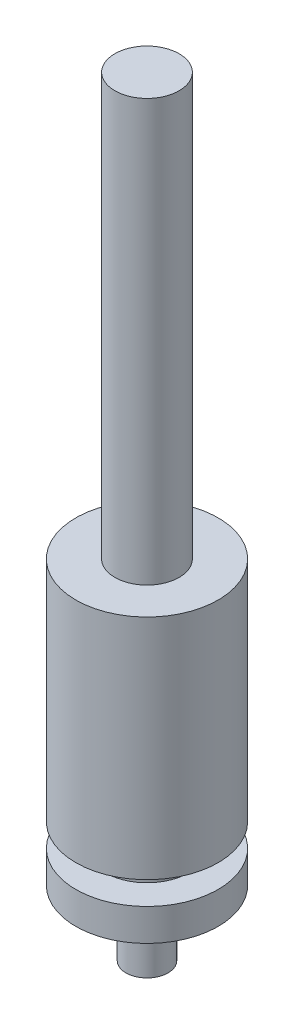
ISO-10303-21;
HEADER;
FILE_DESCRIPTION(('STEP AP214'),'2;1');
FILE_NAME('part.step','',(''),(''),'','','');
FILE_SCHEMA(('AUTOMOTIVE_DESIGN { 1 0 10303 214 1 1 1 1 }'));
ENDSEC;
DATA;
#1=APPLICATION_CONTEXT('core data for automotive mechanical design processes');
#2=APPLICATION_PROTOCOL_DEFINITION('international standard','automotive_design',2000,#1);
#3=PRODUCT_CONTEXT('',#1,'mechanical');
#4=PRODUCT('Part','Part','',(#3));
#5=PRODUCT_RELATED_PRODUCT_CATEGORY('part','',(#4));
#6=PRODUCT_DEFINITION_FORMATION('','',#4);
#7=PRODUCT_DEFINITION_CONTEXT('part definition',#1,'design');
#8=PRODUCT_DEFINITION('design','',#6,#7);
#9=PRODUCT_DEFINITION_SHAPE('','',#8);
#10=(LENGTH_UNIT() NAMED_UNIT(*) SI_UNIT(.MILLI.,.METRE.));
#11=(NAMED_UNIT(*) PLANE_ANGLE_UNIT() SI_UNIT($,.RADIAN.));
#12=(NAMED_UNIT(*) SI_UNIT($,.STERADIAN.) SOLID_ANGLE_UNIT());
#13=UNCERTAINTY_MEASURE_WITH_UNIT(LENGTH_MEASURE(1.E-05),#10,'distance_accuracy_value','');
#14=(GEOMETRIC_REPRESENTATION_CONTEXT(3) GLOBAL_UNCERTAINTY_ASSIGNED_CONTEXT((#13)) GLOBAL_UNIT_ASSIGNED_CONTEXT((#10,
#11,#12)) REPRESENTATION_CONTEXT('',''));
#15=CARTESIAN_POINT('',(0.,0.,0.));
#16=DIRECTION('',(0.,0.,1.));
#17=DIRECTION('',(1.,0.,0.));
#18=AXIS2_PLACEMENT_3D('',#15,#16,#17);
#19=CARTESIAN_POINT('',(0.,67.075,0.));
#20=DIRECTION('',(0.,1.,0.));
#21=DIRECTION('',(0.,0.,1.));
#22=AXIS2_PLACEMENT_3D('',#19,#20,#21);
#23=PLANE('',#22);
#24=CARTESIAN_POINT('',(0.,67.075,0.));
#25=DIRECTION('',(0.,1.,0.));
#26=DIRECTION('',(0.,0.,1.));
#27=AXIS2_PLACEMENT_3D('',#24,#25,#26);
#28=CIRCLE('',#27,16.891);
#29=CARTESIAN_POINT('',(0.,67.075,16.891));
#30=VERTEX_POINT('',#29);
#31=EDGE_CURVE('E54',#30,#30,#28,.T.);
#32=ORIENTED_EDGE('',*,*,#31,.T.);
#33=EDGE_LOOP('',(#32));
#34=FACE_BOUND('',#33,.T.);
#35=CARTESIAN_POINT('',(0.,67.075,0.));
#36=DIRECTION('',(0.,1.,0.));
#37=DIRECTION('',(0.,0.,1.));
#38=AXIS2_PLACEMENT_3D('',#35,#36,#37);
#39=CIRCLE('',#38,7.62);
#40=CARTESIAN_POINT('',(0.,67.075,7.62));
#41=VERTEX_POINT('',#40);
#42=EDGE_CURVE('E72',#41,#41,#39,.T.);
#43=ORIENTED_EDGE('',*,*,#42,.F.);
#44=EDGE_LOOP('',(#43));
#45=FACE_BOUND('',#44,.T.);
#46=ADVANCED_FACE('F33',(#34,#45),#23,.T.);
#47=CARTESIAN_POINT('',(0.,-15.5,0.));
#48=DIRECTION('',(0.,1.,0.));
#49=DIRECTION('',(0.,0.,1.));
#50=AXIS2_PLACEMENT_3D('',#47,#48,#49);
#51=CYLINDRICAL_SURFACE('',#50,5.5);
#52=CARTESIAN_POINT('',(0.,0.,0.));
#53=DIRECTION('',(0.,1.,0.));
#54=DIRECTION('',(0.,0.,1.));
#55=AXIS2_PLACEMENT_3D('',#52,#53,#54);
#56=CIRCLE('',#55,5.5);
#57=CARTESIAN_POINT('',(0.,0.,5.5));
#58=VERTEX_POINT('',#57);
#59=EDGE_CURVE('E10',#58,#58,#56,.F.);
#60=ORIENTED_EDGE('',*,*,#59,.T.);
#61=EDGE_LOOP('',(#60));
#62=FACE_BOUND('',#61,.T.);
#63=CARTESIAN_POINT('',(0.,-6.5,0.));
#64=DIRECTION('',(0.,-1.,0.));
#65=DIRECTION('',(0.,0.,-1.));
#66=AXIS2_PLACEMENT_3D('',#63,#64,#65);
#67=CIRCLE('',#66,5.5);
#68=CARTESIAN_POINT('',(0.,-6.5,-5.5));
#69=VERTEX_POINT('',#68);
#70=EDGE_CURVE('E60',#69,#69,#67,.T.);
#71=ORIENTED_EDGE('',*,*,#70,.F.);
#72=EDGE_LOOP('',(#71));
#73=FACE_BOUND('',#72,.T.);
#74=ADVANCED_FACE('F88',(#62,#73),#51,.T.);
#75=CARTESIAN_POINT('',(0.,0.,0.));
#76=DIRECTION('',(0.,1.,0.));
#77=DIRECTION('',(0.,0.,1.));
#78=AXIS2_PLACEMENT_3D('',#75,#76,#77);
#79=PLANE('',#78);
#80=CARTESIAN_POINT('',(0.,0.,0.));
#81=DIRECTION('',(0.,1.,0.));
#82=DIRECTION('',(0.,0.,1.));
#83=AXIS2_PLACEMENT_3D('',#80,#81,#82);
#84=CIRCLE('',#83,16.891);
#85=CARTESIAN_POINT('',(0.,0.,-16.891));
#86=VERTEX_POINT('',#85);
#87=EDGE_CURVE('E44',#86,#86,#84,.T.);
#88=ORIENTED_EDGE('',*,*,#87,.F.);
#89=EDGE_LOOP('',(#88));
#90=FACE_BOUND('',#89,.T.);
#91=ORIENTED_EDGE('',*,*,#59,.F.);
#92=EDGE_LOOP('',(#91));
#93=FACE_BOUND('',#92,.T.);
#94=ADVANCED_FACE('F96',(#90,#93),#79,.F.);
#95=CARTESIAN_POINT('',(0.,7.6,0.));
#96=DIRECTION('',(0.,1.,0.));
#97=DIRECTION('',(0.,0.,1.));
#98=AXIS2_PLACEMENT_3D('',#95,#96,#97);
#99=PLANE('',#98);
#100=CARTESIAN_POINT('',(0.,7.6,0.));
#101=DIRECTION('',(0.,1.,0.));
#102=DIRECTION('',(0.,0.,1.));
#103=AXIS2_PLACEMENT_3D('',#100,#101,#102);
#104=CIRCLE('',#103,16.891);
#105=CARTESIAN_POINT('',(0.,7.6,-16.891));
#106=VERTEX_POINT('',#105);
#107=EDGE_CURVE('E40',#106,#106,#104,.T.);
#108=ORIENTED_EDGE('',*,*,#107,.T.);
#109=EDGE_LOOP('',(#108));
#110=FACE_BOUND('',#109,.T.);
#111=CARTESIAN_POINT('',(0.,7.6,0.));
#112=DIRECTION('',(0.,1.,0.));
#113=DIRECTION('',(0.,0.,1.));
#114=AXIS2_PLACEMENT_3D('',#111,#112,#113);
#115=CIRCLE('',#114,9.99827606072005);
#116=CARTESIAN_POINT('',(0.,7.6,9.99827606072005));
#117=VERTEX_POINT('',#116);
#118=EDGE_CURVE('E51',#117,#117,#115,.T.);
#119=ORIENTED_EDGE('',*,*,#118,.F.);
#120=EDGE_LOOP('',(#119));
#121=FACE_BOUND('',#120,.T.);
#122=ADVANCED_FACE('F113',(#110,#121),#99,.T.);
#123=CARTESIAN_POINT('',(0.,7.6,0.));
#124=DIRECTION('',(0.,-1.,0.));
#125=DIRECTION('',(0.,0.,-1.));
#126=AXIS2_PLACEMENT_3D('',#123,#124,#125);
#127=CYLINDRICAL_SURFACE('',#126,16.891);
#128=CARTESIAN_POINT('',(0.,7.6,-16.891));
#129=CARTESIAN_POINT('',(0.,7.52083333333333,-16.891));
#130=CARTESIAN_POINT('',(0.,7.44166666666667,-16.891));
#131=CARTESIAN_POINT('',(0.,7.28333333333333,-16.891));
#132=CARTESIAN_POINT('',(0.,7.20416666666667,-16.891));
#133=CARTESIAN_POINT('',(0.,7.04583333333333,-16.891));
#134=CARTESIAN_POINT('',(0.,6.96666666666667,-16.891));
#135=CARTESIAN_POINT('',(0.,6.80833333333333,-16.891));
#136=CARTESIAN_POINT('',(0.,6.72916666666667,-16.891));
#137=CARTESIAN_POINT('',(0.,6.57083333333333,-16.891));
#138=CARTESIAN_POINT('',(0.,6.49166666666667,-16.891));
#139=CARTESIAN_POINT('',(0.,6.33333333333333,-16.891));
#140=CARTESIAN_POINT('',(0.,6.25416666666667,-16.891));
#141=CARTESIAN_POINT('',(0.,6.09583333333333,-16.891));
#142=CARTESIAN_POINT('',(0.,6.01666666666667,-16.891));
#143=CARTESIAN_POINT('',(0.,5.85833333333333,-16.891));
#144=CARTESIAN_POINT('',(0.,5.77916666666667,-16.891));
#145=CARTESIAN_POINT('',(0.,5.62083333333333,-16.891));
#146=CARTESIAN_POINT('',(0.,5.54166666666667,-16.891));
#147=CARTESIAN_POINT('',(0.,5.38333333333333,-16.891));
#148=CARTESIAN_POINT('',(0.,5.30416666666667,-16.891));
#149=CARTESIAN_POINT('',(0.,5.14583333333333,-16.891));
#150=CARTESIAN_POINT('',(0.,5.06666666666667,-16.891));
#151=CARTESIAN_POINT('',(0.,4.90833333333333,-16.891));
#152=CARTESIAN_POINT('',(0.,4.82916666666667,-16.891));
#153=CARTESIAN_POINT('',(0.,4.67083333333333,-16.891));
#154=CARTESIAN_POINT('',(0.,4.59166666666667,-16.891));
#155=CARTESIAN_POINT('',(0.,4.43333333333333,-16.891));
#156=CARTESIAN_POINT('',(0.,4.35416666666667,-16.891));
#157=CARTESIAN_POINT('',(0.,4.19583333333333,-16.891));
#158=CARTESIAN_POINT('',(0.,4.11666666666667,-16.891));
#159=CARTESIAN_POINT('',(0.,3.95833333333333,-16.891));
#160=CARTESIAN_POINT('',(0.,3.87916666666667,-16.891));
#161=CARTESIAN_POINT('',(0.,3.72083333333333,-16.891));
#162=CARTESIAN_POINT('',(0.,3.64166666666667,-16.891));
#163=CARTESIAN_POINT('',(0.,3.48333333333333,-16.891));
#164=CARTESIAN_POINT('',(0.,3.40416666666667,-16.891));
#165=CARTESIAN_POINT('',(0.,3.24583333333333,-16.891));
#166=CARTESIAN_POINT('',(0.,3.16666666666667,-16.891));
#167=CARTESIAN_POINT('',(0.,3.00833333333333,-16.891));
#168=CARTESIAN_POINT('',(0.,2.92916666666667,-16.891));
#169=CARTESIAN_POINT('',(0.,2.77083333333333,-16.891));
#170=CARTESIAN_POINT('',(0.,2.69166666666667,-16.891));
#171=CARTESIAN_POINT('',(0.,2.53333333333333,-16.891));
#172=CARTESIAN_POINT('',(0.,2.45416666666667,-16.891));
#173=CARTESIAN_POINT('',(0.,2.29583333333333,-16.891));
#174=CARTESIAN_POINT('',(0.,2.21666666666667,-16.891));
#175=CARTESIAN_POINT('',(0.,2.05833333333333,-16.891));
#176=CARTESIAN_POINT('',(0.,1.97916666666667,-16.891));
#177=CARTESIAN_POINT('',(0.,1.82083333333333,-16.891));
#178=CARTESIAN_POINT('',(0.,1.74166666666667,-16.891));
#179=CARTESIAN_POINT('',(0.,1.58333333333333,-16.891));
#180=CARTESIAN_POINT('',(0.,1.50416666666667,-16.891));
#181=CARTESIAN_POINT('',(0.,1.34583333333333,-16.891));
#182=CARTESIAN_POINT('',(0.,1.26666666666667,-16.891));
#183=CARTESIAN_POINT('',(0.,1.10833333333333,-16.891));
#184=CARTESIAN_POINT('',(0.,1.02916666666667,-16.891));
#185=CARTESIAN_POINT('',(0.,0.870833333333333,-16.891));
#186=CARTESIAN_POINT('',(0.,0.791666666666667,-16.891));
#187=CARTESIAN_POINT('',(0.,0.633333333333333,-16.891));
#188=CARTESIAN_POINT('',(0.,0.554166666666666,-16.891));
#189=CARTESIAN_POINT('',(0.,0.395833333333333,-16.891));
#190=CARTESIAN_POINT('',(0.,0.316666666666667,-16.891));
#191=CARTESIAN_POINT('',(0.,0.158333333333333,-16.891));
#192=CARTESIAN_POINT('',(0.,0.0791666666666665,-16.891));
#193=CARTESIAN_POINT('',(0.,0.,-16.891));
#194=B_SPLINE_CURVE_WITH_KNOTS('',3,(#128,#129,#130,#131,#132,#133,#134,#135,#136,#137,#138,
#139,#140,#141,#142,#143,#144,#145,#146,#147,#148,#149,#150,#151,#152,#153,#154,#155,#156,#157,
#158,#159,#160,#161,#162,#163,#164,#165,#166,#167,#168,#169,#170,#171,#172,#173,#174,#175,#176,
#177,#178,#179,#180,#181,#182,#183,#184,#185,#186,#187,#188,#189,#190,#191,#192,#193),
.UNSPECIFIED.,.F.,.F.,(4,2,2,2,2,2,2,2,2,2,2,2,2,2,2,2,2,2,2,2,2,2,2,2,2,2,2,2,2,2,2,2,4),(0.,
0.2375,0.475,0.7125,0.95,1.1875,1.425,1.6625,1.9,2.1375,2.375,2.6125,2.85,3.0875,3.325,3.5625,
3.8,4.0375,4.275,4.5125,4.75,4.9875,5.225,5.4625,5.7,5.9375,6.175,6.4125,6.65,6.8875,7.125,
7.3625,7.6),.UNSPECIFIED.);
#195=EDGE_CURVE('BSEAM35',#106,#86,#194,.T.);
#196=ORIENTED_EDGE('',*,*,#107,.F.);
#197=ORIENTED_EDGE('',*,*,#87,.T.);
#198=ORIENTED_EDGE('',*,*,#195,.T.);
#199=ORIENTED_EDGE('',*,*,#195,.F.);
#200=EDGE_LOOP('',(#196,#198,#197,#199));
#201=FACE_BOUND('',#200,.T.);
#202=ADVANCED_FACE('F35',(#201),#127,.T.);
#203=CARTESIAN_POINT('',(0.,13.1,0.));
#204=DIRECTION('',(0.,-1.,0.));
#205=DIRECTION('',(0.,0.,-1.));
#206=AXIS2_PLACEMENT_3D('',#203,#204,#205);
#207=CYLINDRICAL_SURFACE('',#206,9.99827606072005);
#208=CARTESIAN_POINT('',(0.,13.1,0.));
#209=DIRECTION('',(0.,1.,0.));
#210=DIRECTION('',(0.,0.,1.));
#211=AXIS2_PLACEMENT_3D('',#208,#209,#210);
#212=CIRCLE('',#211,9.99827606072005);
#213=CARTESIAN_POINT('',(0.,13.1,9.99827606072005));
#214=VERTEX_POINT('',#213);
#215=EDGE_CURVE('E49',#214,#214,#212,.T.);
#216=ORIENTED_EDGE('',*,*,#215,.F.);
#217=EDGE_LOOP('',(#216));
#218=FACE_BOUND('',#217,.T.);
#219=ORIENTED_EDGE('',*,*,#118,.T.);
#220=EDGE_LOOP('',(#219));
#221=FACE_BOUND('',#220,.T.);
#222=ADVANCED_FACE('F104',(#218,#221),#207,.T.);
#223=CARTESIAN_POINT('',(0.,13.1,0.));
#224=DIRECTION('',(0.,1.,0.));
#225=DIRECTION('',(0.,0.,1.));
#226=AXIS2_PLACEMENT_3D('',#223,#224,#225);
#227=PLANE('',#226);
#228=CARTESIAN_POINT('',(0.,13.1,0.));
#229=DIRECTION('',(0.,1.,0.));
#230=DIRECTION('',(0.,0.,1.));
#231=AXIS2_PLACEMENT_3D('',#228,#229,#230);
#232=CIRCLE('',#231,16.891);
#233=CARTESIAN_POINT('',(0.,13.1,16.891));
#234=VERTEX_POINT('',#233);
#235=EDGE_CURVE('E57',#234,#234,#232,.T.);
#236=ORIENTED_EDGE('',*,*,#235,.F.);
#237=EDGE_LOOP('',(#236));
#238=FACE_BOUND('',#237,.T.);
#239=ORIENTED_EDGE('',*,*,#215,.T.);
#240=EDGE_LOOP('',(#239));
#241=FACE_BOUND('',#240,.T.);
#242=ADVANCED_FACE('F100',(#238,#241),#227,.F.);
#243=CARTESIAN_POINT('',(0.,67.075,0.));
#244=DIRECTION('',(0.,-1.,0.));
#245=DIRECTION('',(0.,0.,-1.));
#246=AXIS2_PLACEMENT_3D('',#243,#244,#245);
#247=CYLINDRICAL_SURFACE('',#246,16.891);
#248=ORIENTED_EDGE('',*,*,#31,.F.);
#249=EDGE_LOOP('',(#248));
#250=FACE_BOUND('',#249,.T.);
#251=ORIENTED_EDGE('',*,*,#235,.T.);
#252=EDGE_LOOP('',(#251));
#253=FACE_BOUND('',#252,.T.);
#254=ADVANCED_FACE('F103',(#250,#253),#247,.T.);
#255=CARTESIAN_POINT('',(0.,-6.5,0.));
#256=DIRECTION('',(0.,-1.,0.));
#257=DIRECTION('',(0.,0.,-1.));
#258=AXIS2_PLACEMENT_3D('',#255,#256,#257);
#259=PLANE('',#258);
#260=CARTESIAN_POINT('',(0.,-6.5,0.));
#261=DIRECTION('',(0.,-1.,0.));
#262=DIRECTION('',(0.,0.,-1.));
#263=AXIS2_PLACEMENT_3D('',#260,#261,#262);
#264=CIRCLE('',#263,5.);
#265=CARTESIAN_POINT('',(0.,-6.5,-5.));
#266=VERTEX_POINT('',#265);
#267=EDGE_CURVE('E65',#266,#266,#264,.T.);
#268=ORIENTED_EDGE('',*,*,#267,.F.);
#269=EDGE_LOOP('',(#268));
#270=FACE_BOUND('',#269,.T.);
#271=ORIENTED_EDGE('',*,*,#70,.T.);
#272=EDGE_LOOP('',(#271));
#273=FACE_BOUND('',#272,.T.);
#274=ADVANCED_FACE('F108',(#270,#273),#259,.T.);
#275=CARTESIAN_POINT('',(0.,-6.5,0.));
#276=DIRECTION('',(0.,-1.,0.));
#277=DIRECTION('',(0.,0.,-1.));
#278=AXIS2_PLACEMENT_3D('',#275,#276,#277);
#279=CYLINDRICAL_SURFACE('',#278,5.);
#280=ORIENTED_EDGE('',*,*,#267,.T.);
#281=EDGE_LOOP('',(#280));
#282=FACE_BOUND('',#281,.T.);
#283=CARTESIAN_POINT('',(0.,-15.5,0.));
#284=DIRECTION('',(0.,-1.,0.));
#285=DIRECTION('',(0.,0.,-1.));
#286=AXIS2_PLACEMENT_3D('',#283,#284,#285);
#287=CIRCLE('',#286,5.);
#288=CARTESIAN_POINT('',(0.,-15.5,-5.));
#289=VERTEX_POINT('',#288);
#290=EDGE_CURVE('E66',#289,#289,#287,.T.);
#291=ORIENTED_EDGE('',*,*,#290,.F.);
#292=EDGE_LOOP('',(#291));
#293=FACE_BOUND('',#292,.T.);
#294=ADVANCED_FACE('F146',(#282,#293),#279,.T.);
#295=CARTESIAN_POINT('',(0.,-15.5,0.));
#296=DIRECTION('',(0.,-1.,0.));
#297=DIRECTION('',(0.,0.,-1.));
#298=AXIS2_PLACEMENT_3D('',#295,#296,#297);
#299=PLANE('',#298);
#300=ORIENTED_EDGE('',*,*,#290,.T.);
#301=EDGE_LOOP('',(#300));
#302=FACE_BOUND('',#301,.T.);
#303=ADVANCED_FACE('F83',(#302),#299,.T.);
#304=CARTESIAN_POINT('',(0.,167.075,0.));
#305=DIRECTION('',(0.,-1.,0.));
#306=DIRECTION('',(0.,0.,-1.));
#307=AXIS2_PLACEMENT_3D('',#304,#305,#306);
#308=CYLINDRICAL_SURFACE('',#307,7.62);
#309=CARTESIAN_POINT('',(0.,167.075,0.));
#310=DIRECTION('',(0.,1.,0.));
#311=DIRECTION('',(0.,0.,1.));
#312=AXIS2_PLACEMENT_3D('',#309,#310,#311);
#313=CIRCLE('',#312,7.62);
#314=CARTESIAN_POINT('',(0.,167.075,7.62));
#315=VERTEX_POINT('',#314);
#316=EDGE_CURVE('E69',#315,#315,#313,.T.);
#317=ORIENTED_EDGE('',*,*,#316,.F.);
#318=EDGE_LOOP('',(#317));
#319=FACE_BOUND('',#318,.T.);
#320=ORIENTED_EDGE('',*,*,#42,.T.);
#321=EDGE_LOOP('',(#320));
#322=FACE_BOUND('',#321,.T.);
#323=ADVANCED_FACE('F80',(#319,#322),#308,.T.);
#324=CARTESIAN_POINT('',(0.,167.075,0.));
#325=DIRECTION('',(0.,1.,0.));
#326=DIRECTION('',(0.,0.,1.));
#327=AXIS2_PLACEMENT_3D('',#324,#325,#326);
#328=PLANE('',#327);
#329=ORIENTED_EDGE('',*,*,#316,.T.);
#330=EDGE_LOOP('',(#329));
#331=FACE_BOUND('',#330,.T.);
#332=ADVANCED_FACE('F78',(#331),#328,.T.);
#333=CLOSED_SHELL('',(#46,#74,#94,#122,#202,#222,#242,#254,#274,#294,#303,#323,#332));
#334=MANIFOLD_SOLID_BREP('B2',#333);
#335=ADVANCED_BREP_SHAPE_REPRESENTATION('',(#18,#334),#14);
#336=SHAPE_DEFINITION_REPRESENTATION(#9,#335);
ENDSEC;
END-ISO-10303-21;
